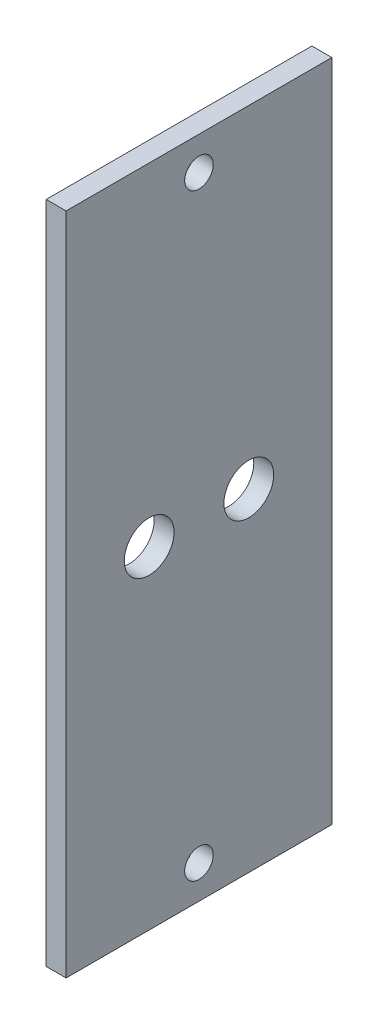
ISO-10303-21;
HEADER;
FILE_DESCRIPTION(('STEP AP214'),'2;1');
FILE_NAME('part.step','',(''),(''),'','','');
FILE_SCHEMA(('AUTOMOTIVE_DESIGN { 1 0 10303 214 1 1 1 1 }'));
ENDSEC;
DATA;
#1=APPLICATION_CONTEXT('core data for automotive mechanical design processes');
#2=APPLICATION_PROTOCOL_DEFINITION('international standard','automotive_design',2000,#1);
#3=PRODUCT_CONTEXT('',#1,'mechanical');
#4=PRODUCT('Part','Part','',(#3));
#5=PRODUCT_RELATED_PRODUCT_CATEGORY('part','',(#4));
#6=PRODUCT_DEFINITION_FORMATION('','',#4);
#7=PRODUCT_DEFINITION_CONTEXT('part definition',#1,'design');
#8=PRODUCT_DEFINITION('design','',#6,#7);
#9=PRODUCT_DEFINITION_SHAPE('','',#8);
#10=(LENGTH_UNIT() NAMED_UNIT(*) SI_UNIT(.MILLI.,.METRE.));
#11=(NAMED_UNIT(*) PLANE_ANGLE_UNIT() SI_UNIT($,.RADIAN.));
#12=(NAMED_UNIT(*) SI_UNIT($,.STERADIAN.) SOLID_ANGLE_UNIT());
#13=UNCERTAINTY_MEASURE_WITH_UNIT(LENGTH_MEASURE(1.E-05),#10,'distance_accuracy_value','');
#14=(GEOMETRIC_REPRESENTATION_CONTEXT(3) GLOBAL_UNCERTAINTY_ASSIGNED_CONTEXT((#13)) GLOBAL_UNIT_ASSIGNED_CONTEXT((#10,
#11,#12)) REPRESENTATION_CONTEXT('',''));
#15=CARTESIAN_POINT('',(0.,0.,0.));
#16=DIRECTION('',(0.,0.,1.));
#17=DIRECTION('',(1.,0.,0.));
#18=AXIS2_PLACEMENT_3D('',#15,#16,#17);
#19=CARTESIAN_POINT('',(3.,0.,0.));
#20=DIRECTION('',(-1.,0.,0.));
#21=DIRECTION('',(0.,0.,1.));
#22=AXIS2_PLACEMENT_3D('',#19,#20,#21);
#23=PLANE('',#22);
#24=DIRECTION('',(0.,-1.,0.));
#25=VECTOR('',#24,1.);
#26=CARTESIAN_POINT('',(3.,0.,0.));
#27=LINE('',#26,#25);
#28=CARTESIAN_POINT('',(3.,100.,0.));
#29=VERTEX_POINT('',#28);
#30=CARTESIAN_POINT('',(3.,0.,0.));
#31=VERTEX_POINT('',#30);
#32=EDGE_CURVE('E93',#29,#31,#27,.T.);
#33=ORIENTED_EDGE('',*,*,#32,.T.);
#34=DIRECTION('',(0.,0.,-1.));
#35=VECTOR('',#34,1.);
#36=CARTESIAN_POINT('',(3.,0.,0.));
#37=LINE('',#36,#35);
#38=CARTESIAN_POINT('',(3.,0.,-40.));
#39=VERTEX_POINT('',#38);
#40=EDGE_CURVE('E88',#31,#39,#37,.T.);
#41=ORIENTED_EDGE('',*,*,#40,.T.);
#42=DIRECTION('',(0.,1.,0.));
#43=VECTOR('',#42,1.);
#44=CARTESIAN_POINT('',(3.,0.,-40.));
#45=LINE('',#44,#43);
#46=CARTESIAN_POINT('',(3.,100.,-40.));
#47=VERTEX_POINT('',#46);
#48=EDGE_CURVE('E91',#39,#47,#45,.T.);
#49=ORIENTED_EDGE('',*,*,#48,.T.);
#50=DIRECTION('',(0.,0.,1.));
#51=VECTOR('',#50,1.);
#52=CARTESIAN_POINT('',(3.,100.,0.));
#53=LINE('',#52,#51);
#54=EDGE_CURVE('E58',#47,#29,#53,.T.);
#55=ORIENTED_EDGE('',*,*,#54,.T.);
#56=EDGE_LOOP('',(#33,#41,#49,#55));
#57=FACE_BOUND('',#56,.T.);
#58=CARTESIAN_POINT('',(3.,95.,-20.));
#59=DIRECTION('',(1.,0.,0.));
#60=DIRECTION('',(0.,0.,-1.));
#61=AXIS2_PLACEMENT_3D('',#58,#59,#60);
#62=CIRCLE('',#61,2.15);
#63=CARTESIAN_POINT('',(3.,95.,-22.15));
#64=VERTEX_POINT('',#63);
#65=EDGE_CURVE('E108',#64,#64,#62,.T.);
#66=ORIENTED_EDGE('',*,*,#65,.F.);
#67=EDGE_LOOP('',(#66));
#68=FACE_BOUND('',#67,.T.);
#69=CARTESIAN_POINT('',(3.,5.,-20.));
#70=DIRECTION('',(1.,0.,0.));
#71=DIRECTION('',(0.,0.,-1.));
#72=AXIS2_PLACEMENT_3D('',#69,#70,#71);
#73=CIRCLE('',#72,2.15);
#74=CARTESIAN_POINT('',(3.,5.,-22.15));
#75=VERTEX_POINT('',#74);
#76=EDGE_CURVE('E123',#75,#75,#73,.T.);
#77=ORIENTED_EDGE('',*,*,#76,.F.);
#78=EDGE_LOOP('',(#77));
#79=FACE_BOUND('',#78,.T.);
#80=CARTESIAN_POINT('',(3.,50.,-12.5));
#81=DIRECTION('',(1.,0.,0.));
#82=DIRECTION('',(0.,0.,-1.));
#83=AXIS2_PLACEMENT_3D('',#80,#81,#82);
#84=CIRCLE('',#83,3.75);
#85=CARTESIAN_POINT('',(3.,50.,-16.25));
#86=VERTEX_POINT('',#85);
#87=EDGE_CURVE('E129',#86,#86,#84,.T.);
#88=ORIENTED_EDGE('',*,*,#87,.F.);
#89=EDGE_LOOP('',(#88));
#90=FACE_BOUND('',#89,.T.);
#91=CARTESIAN_POINT('',(3.,50.,-27.5));
#92=DIRECTION('',(1.,0.,0.));
#93=DIRECTION('',(0.,0.,-1.));
#94=AXIS2_PLACEMENT_3D('',#91,#92,#93);
#95=CIRCLE('',#94,3.75000000000001);
#96=CARTESIAN_POINT('',(3.,50.,-31.25));
#97=VERTEX_POINT('',#96);
#98=EDGE_CURVE('E135',#97,#97,#95,.T.);
#99=ORIENTED_EDGE('',*,*,#98,.F.);
#100=EDGE_LOOP('',(#99));
#101=FACE_BOUND('',#100,.T.);
#102=ADVANCED_FACE('F41',(#57,#68,#79,#90,#101),#23,.F.);
#103=CARTESIAN_POINT('',(0.,0.,0.));
#104=DIRECTION('',(-1.,0.,0.));
#105=DIRECTION('',(0.,0.,1.));
#106=AXIS2_PLACEMENT_3D('',#103,#104,#105);
#107=PLANE('',#106);
#108=CARTESIAN_POINT('',(0.,50.,-12.5));
#109=DIRECTION('',(1.,0.,0.));
#110=DIRECTION('',(0.,0.,-1.));
#111=AXIS2_PLACEMENT_3D('',#108,#109,#110);
#112=CIRCLE('',#111,3.75);
#113=CARTESIAN_POINT('',(0.,50.,-16.25));
#114=VERTEX_POINT('',#113);
#115=EDGE_CURVE('E132',#114,#114,#112,.T.);
#116=ORIENTED_EDGE('',*,*,#115,.T.);
#117=EDGE_LOOP('',(#116));
#118=FACE_BOUND('',#117,.T.);
#119=CARTESIAN_POINT('',(0.,95.,-20.));
#120=DIRECTION('',(1.,0.,0.));
#121=DIRECTION('',(0.,0.,-1.));
#122=AXIS2_PLACEMENT_3D('',#119,#120,#121);
#123=CIRCLE('',#122,2.15);
#124=CARTESIAN_POINT('',(0.,95.,-22.15));
#125=VERTEX_POINT('',#124);
#126=EDGE_CURVE('E120',#125,#125,#123,.T.);
#127=ORIENTED_EDGE('',*,*,#126,.T.);
#128=EDGE_LOOP('',(#127));
#129=FACE_BOUND('',#128,.T.);
#130=DIRECTION('',(0.,-1.,0.));
#131=VECTOR('',#130,1.);
#132=CARTESIAN_POINT('',(0.,0.,0.));
#133=LINE('',#132,#131);
#134=CARTESIAN_POINT('',(0.,100.,0.));
#135=VERTEX_POINT('',#134);
#136=CARTESIAN_POINT('',(0.,0.,0.));
#137=VERTEX_POINT('',#136);
#138=EDGE_CURVE('E105',#135,#137,#133,.T.);
#139=ORIENTED_EDGE('',*,*,#138,.F.);
#140=DIRECTION('',(0.,0.,1.));
#141=VECTOR('',#140,1.);
#142=CARTESIAN_POINT('',(0.,100.,0.));
#143=LINE('',#142,#141);
#144=CARTESIAN_POINT('',(0.,100.,-40.));
#145=VERTEX_POINT('',#144);
#146=EDGE_CURVE('E81',#145,#135,#143,.T.);
#147=ORIENTED_EDGE('',*,*,#146,.F.);
#148=DIRECTION('',(0.,1.,0.));
#149=VECTOR('',#148,1.);
#150=CARTESIAN_POINT('',(0.,0.,-40.));
#151=LINE('',#150,#149);
#152=CARTESIAN_POINT('',(0.,0.,-40.));
#153=VERTEX_POINT('',#152);
#154=EDGE_CURVE('E75',#153,#145,#151,.T.);
#155=ORIENTED_EDGE('',*,*,#154,.F.);
#156=DIRECTION('',(0.,0.,-1.));
#157=VECTOR('',#156,1.);
#158=CARTESIAN_POINT('',(0.,0.,0.));
#159=LINE('',#158,#157);
#160=EDGE_CURVE('E97',#137,#153,#159,.T.);
#161=ORIENTED_EDGE('',*,*,#160,.F.);
#162=EDGE_LOOP('',(#139,#147,#155,#161));
#163=FACE_BOUND('',#162,.T.);
#164=CARTESIAN_POINT('',(0.,5.,-20.));
#165=DIRECTION('',(1.,0.,0.));
#166=DIRECTION('',(0.,0.,-1.));
#167=AXIS2_PLACEMENT_3D('',#164,#165,#166);
#168=CIRCLE('',#167,2.15);
#169=CARTESIAN_POINT('',(0.,5.,-22.15));
#170=VERTEX_POINT('',#169);
#171=EDGE_CURVE('E126',#170,#170,#168,.T.);
#172=ORIENTED_EDGE('',*,*,#171,.T.);
#173=EDGE_LOOP('',(#172));
#174=FACE_BOUND('',#173,.T.);
#175=CARTESIAN_POINT('',(0.,50.,-27.5));
#176=DIRECTION('',(1.,0.,0.));
#177=DIRECTION('',(0.,0.,-1.));
#178=AXIS2_PLACEMENT_3D('',#175,#176,#177);
#179=CIRCLE('',#178,3.75000000000001);
#180=CARTESIAN_POINT('',(0.,50.,-31.25));
#181=VERTEX_POINT('',#180);
#182=EDGE_CURVE('E138',#181,#181,#179,.T.);
#183=ORIENTED_EDGE('',*,*,#182,.T.);
#184=EDGE_LOOP('',(#183));
#185=FACE_BOUND('',#184,.T.);
#186=ADVANCED_FACE('F116',(#118,#129,#163,#174,#185),#107,.T.);
#187=CARTESIAN_POINT('',(3.,0.,0.));
#188=DIRECTION('',(0.,0.,-1.));
#189=DIRECTION('',(-1.,0.,0.));
#190=AXIS2_PLACEMENT_3D('',#187,#188,#189);
#191=PLANE('',#190);
#192=ORIENTED_EDGE('',*,*,#138,.T.);
#193=DIRECTION('',(-1.,0.,0.));
#194=VECTOR('',#193,1.);
#195=CARTESIAN_POINT('',(3.,0.,0.));
#196=LINE('',#195,#194);
#197=EDGE_CURVE('E11',#31,#137,#196,.T.);
#198=ORIENTED_EDGE('',*,*,#197,.F.);
#199=ORIENTED_EDGE('',*,*,#32,.F.);
#200=DIRECTION('',(-1.,0.,0.));
#201=VECTOR('',#200,1.);
#202=CARTESIAN_POINT('',(3.,100.,0.));
#203=LINE('',#202,#201);
#204=EDGE_CURVE('E101',#29,#135,#203,.T.);
#205=ORIENTED_EDGE('',*,*,#204,.T.);
#206=EDGE_LOOP('',(#192,#198,#199,#205));
#207=FACE_BOUND('',#206,.T.);
#208=ADVANCED_FACE('F43',(#207),#191,.F.);
#209=CARTESIAN_POINT('',(3.,0.,0.));
#210=DIRECTION('',(0.,1.,0.));
#211=DIRECTION('',(0.,0.,1.));
#212=AXIS2_PLACEMENT_3D('',#209,#210,#211);
#213=PLANE('',#212);
#214=ORIENTED_EDGE('',*,*,#160,.T.);
#215=DIRECTION('',(-1.,0.,0.));
#216=VECTOR('',#215,1.);
#217=CARTESIAN_POINT('',(3.,0.,-40.));
#218=LINE('',#217,#216);
#219=EDGE_CURVE('E50',#39,#153,#218,.T.);
#220=ORIENTED_EDGE('',*,*,#219,.F.);
#221=ORIENTED_EDGE('',*,*,#40,.F.);
#222=ORIENTED_EDGE('',*,*,#197,.T.);
#223=EDGE_LOOP('',(#214,#220,#221,#222));
#224=FACE_BOUND('',#223,.T.);
#225=ADVANCED_FACE('F96',(#224),#213,.F.);
#226=CARTESIAN_POINT('',(3.,0.,-40.));
#227=DIRECTION('',(0.,0.,1.));
#228=DIRECTION('',(1.,0.,0.));
#229=AXIS2_PLACEMENT_3D('',#226,#227,#228);
#230=PLANE('',#229);
#231=ORIENTED_EDGE('',*,*,#154,.T.);
#232=DIRECTION('',(-1.,0.,0.));
#233=VECTOR('',#232,1.);
#234=CARTESIAN_POINT('',(3.,100.,-40.));
#235=LINE('',#234,#233);
#236=EDGE_CURVE('E98',#47,#145,#235,.T.);
#237=ORIENTED_EDGE('',*,*,#236,.F.);
#238=ORIENTED_EDGE('',*,*,#48,.F.);
#239=ORIENTED_EDGE('',*,*,#219,.T.);
#240=EDGE_LOOP('',(#231,#237,#238,#239));
#241=FACE_BOUND('',#240,.T.);
#242=ADVANCED_FACE('F99',(#241),#230,.F.);
#243=CARTESIAN_POINT('',(3.,100.,0.));
#244=DIRECTION('',(0.,-1.,0.));
#245=DIRECTION('',(0.,0.,-1.));
#246=AXIS2_PLACEMENT_3D('',#243,#244,#245);
#247=PLANE('',#246);
#248=ORIENTED_EDGE('',*,*,#146,.T.);
#249=ORIENTED_EDGE('',*,*,#204,.F.);
#250=ORIENTED_EDGE('',*,*,#54,.F.);
#251=ORIENTED_EDGE('',*,*,#236,.T.);
#252=EDGE_LOOP('',(#248,#249,#250,#251));
#253=FACE_BOUND('',#252,.T.);
#254=ADVANCED_FACE('F113',(#253),#247,.F.);
#255=CARTESIAN_POINT('',(3.,95.,-20.));
#256=DIRECTION('',(-1.,0.,0.));
#257=DIRECTION('',(0.,0.,1.));
#258=AXIS2_PLACEMENT_3D('',#255,#256,#257);
#259=CYLINDRICAL_SURFACE('',#258,2.15);
#260=ORIENTED_EDGE('',*,*,#65,.T.);
#261=EDGE_LOOP('',(#260));
#262=FACE_BOUND('',#261,.T.);
#263=ORIENTED_EDGE('',*,*,#126,.F.);
#264=EDGE_LOOP('',(#263));
#265=FACE_BOUND('',#264,.T.);
#266=ADVANCED_FACE('F155',(#262,#265),#259,.F.);
#267=CARTESIAN_POINT('',(3.,5.,-20.));
#268=DIRECTION('',(-1.,0.,0.));
#269=DIRECTION('',(0.,0.,1.));
#270=AXIS2_PLACEMENT_3D('',#267,#268,#269);
#271=CYLINDRICAL_SURFACE('',#270,2.15);
#272=ORIENTED_EDGE('',*,*,#76,.T.);
#273=EDGE_LOOP('',(#272));
#274=FACE_BOUND('',#273,.T.);
#275=ORIENTED_EDGE('',*,*,#171,.F.);
#276=EDGE_LOOP('',(#275));
#277=FACE_BOUND('',#276,.T.);
#278=ADVANCED_FACE('F209',(#274,#277),#271,.F.);
#279=CARTESIAN_POINT('',(3.,50.,-12.5));
#280=DIRECTION('',(-1.,0.,0.));
#281=DIRECTION('',(0.,0.,1.));
#282=AXIS2_PLACEMENT_3D('',#279,#280,#281);
#283=CYLINDRICAL_SURFACE('',#282,3.75);
#284=ORIENTED_EDGE('',*,*,#87,.T.);
#285=EDGE_LOOP('',(#284));
#286=FACE_BOUND('',#285,.T.);
#287=ORIENTED_EDGE('',*,*,#115,.F.);
#288=EDGE_LOOP('',(#287));
#289=FACE_BOUND('',#288,.T.);
#290=ADVANCED_FACE('F218',(#286,#289),#283,.F.);
#291=CARTESIAN_POINT('',(3.,50.,-27.5));
#292=DIRECTION('',(-1.,0.,0.));
#293=DIRECTION('',(0.,0.,1.));
#294=AXIS2_PLACEMENT_3D('',#291,#292,#293);
#295=CYLINDRICAL_SURFACE('',#294,3.75000000000001);
#296=ORIENTED_EDGE('',*,*,#98,.T.);
#297=EDGE_LOOP('',(#296));
#298=FACE_BOUND('',#297,.T.);
#299=ORIENTED_EDGE('',*,*,#182,.F.);
#300=EDGE_LOOP('',(#299));
#301=FACE_BOUND('',#300,.T.);
#302=ADVANCED_FACE('F144',(#298,#301),#295,.F.);
#303=CLOSED_SHELL('',(#102,#186,#208,#225,#242,#254,#266,#278,#290,#302));
#304=MANIFOLD_SOLID_BREP('B2',#303);
#305=ADVANCED_BREP_SHAPE_REPRESENTATION('',(#18,#304),#14);
#306=SHAPE_DEFINITION_REPRESENTATION(#9,#305);
ENDSEC;
END-ISO-10303-21;
